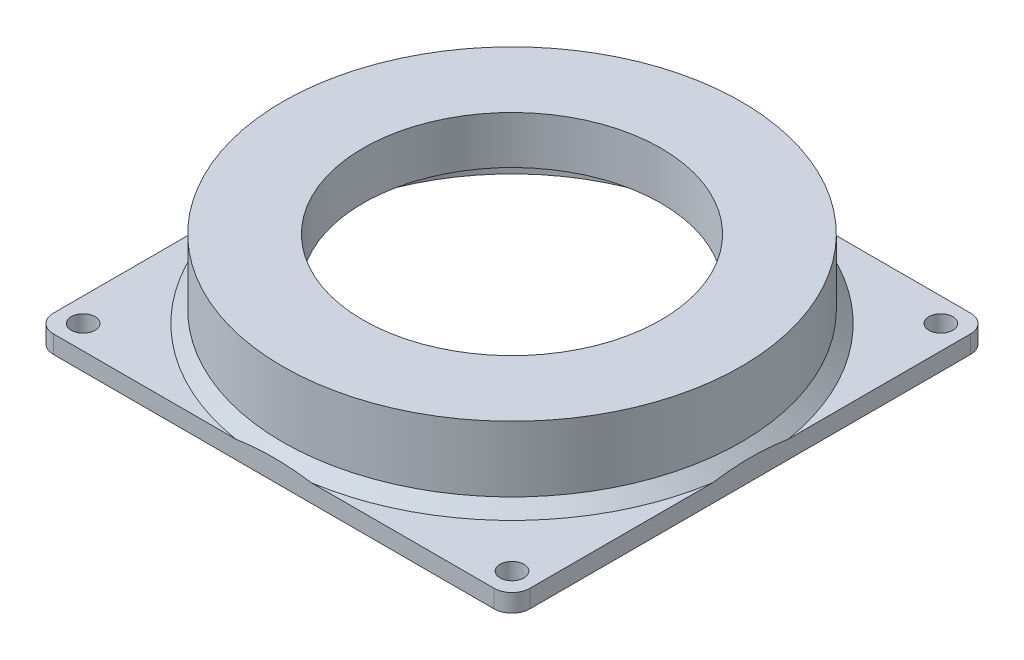
ISO-10303-21;
HEADER;
FILE_DESCRIPTION(('STEP AP214'),'2;1');
FILE_NAME('part.step','',(''),(''),'','','');
FILE_SCHEMA(('AUTOMOTIVE_DESIGN { 1 0 10303 214 1 1 1 1 }'));
ENDSEC;
DATA;
#1=APPLICATION_CONTEXT('core data for automotive mechanical design processes');
#2=APPLICATION_PROTOCOL_DEFINITION('international standard','automotive_design',2000,#1);
#3=PRODUCT_CONTEXT('',#1,'mechanical');
#4=PRODUCT('Part','Part','',(#3));
#5=PRODUCT_RELATED_PRODUCT_CATEGORY('part','',(#4));
#6=PRODUCT_DEFINITION_FORMATION('','',#4);
#7=PRODUCT_DEFINITION_CONTEXT('part definition',#1,'design');
#8=PRODUCT_DEFINITION('design','',#6,#7);
#9=PRODUCT_DEFINITION_SHAPE('','',#8);
#10=(LENGTH_UNIT() NAMED_UNIT(*) SI_UNIT(.MILLI.,.METRE.));
#11=(NAMED_UNIT(*) PLANE_ANGLE_UNIT() SI_UNIT($,.RADIAN.));
#12=(NAMED_UNIT(*) SI_UNIT($,.STERADIAN.) SOLID_ANGLE_UNIT());
#13=UNCERTAINTY_MEASURE_WITH_UNIT(LENGTH_MEASURE(1.E-05),#10,'distance_accuracy_value','');
#14=(GEOMETRIC_REPRESENTATION_CONTEXT(3) GLOBAL_UNCERTAINTY_ASSIGNED_CONTEXT((#13)) GLOBAL_UNIT_ASSIGNED_CONTEXT((#10,
#11,#12)) REPRESENTATION_CONTEXT('',''));
#15=CARTESIAN_POINT('',(0.,0.,0.));
#16=DIRECTION('',(0.,0.,1.));
#17=DIRECTION('',(1.,0.,0.));
#18=AXIS2_PLACEMENT_3D('',#15,#16,#17);
#19=CARTESIAN_POINT('',(0.,3.,0.));
#20=DIRECTION('',(0.,1.,0.));
#21=DIRECTION('',(0.,0.,1.));
#22=AXIS2_PLACEMENT_3D('',#19,#20,#21);
#23=PLANE('',#22);
#24=CARTESIAN_POINT('',(-36.,3.,-36.));
#25=DIRECTION('',(0.,1.,0.));
#26=DIRECTION('',(0.,0.,1.));
#27=AXIS2_PLACEMENT_3D('',#24,#25,#26);
#28=CIRCLE('',#27,2.);
#29=CARTESIAN_POINT('',(-36.,3.,-34.));
#30=VERTEX_POINT('',#29);
#31=EDGE_CURVE('E337',#30,#30,#28,.T.);
#32=ORIENTED_EDGE('',*,*,#31,.F.);
#33=EDGE_LOOP('',(#32));
#34=FACE_BOUND('',#33,.T.);
#35=DIRECTION('',(0.,0.,1.));
#36=VECTOR('',#35,1.);
#37=CARTESIAN_POINT('',(-40.,3.,-40.));
#38=LINE('',#37,#36);
#39=CARTESIAN_POINT('',(-40.,3.,-37.));
#40=VERTEX_POINT('',#39);
#41=CARTESIAN_POINT('',(-40.,3.,-6.34428877022489));
#42=VERTEX_POINT('',#41);
#43=EDGE_CURVE('E150',#40,#42,#38,.T.);
#44=ORIENTED_EDGE('',*,*,#43,.T.);
#45=CARTESIAN_POINT('',(0.,3.,0.));
#46=DIRECTION('',(0.,1.,0.));
#47=DIRECTION('',(0.,0.,1.));
#48=AXIS2_PLACEMENT_3D('',#45,#46,#47);
#49=CIRCLE('',#48,40.5);
#50=CARTESIAN_POINT('',(-6.34428877022494,3.,-40.));
#51=VERTEX_POINT('',#50);
#52=EDGE_CURVE('E209',#42,#51,#49,.F.);
#53=ORIENTED_EDGE('',*,*,#52,.T.);
#54=DIRECTION('',(-1.,0.,0.));
#55=VECTOR('',#54,1.);
#56=CARTESIAN_POINT('',(-40.,3.,-40.));
#57=LINE('',#56,#55);
#58=CARTESIAN_POINT('',(-37.,3.,-40.));
#59=VERTEX_POINT('',#58);
#60=EDGE_CURVE('E298',#51,#59,#57,.T.);
#61=ORIENTED_EDGE('',*,*,#60,.T.);
#62=CARTESIAN_POINT('',(-37.,3.,-37.));
#63=DIRECTION('',(0.,1.,0.));
#64=DIRECTION('',(0.,0.,1.));
#65=AXIS2_PLACEMENT_3D('',#62,#63,#64);
#66=CIRCLE('',#65,3.);
#67=EDGE_CURVE('E181',#59,#40,#66,.T.);
#68=ORIENTED_EDGE('',*,*,#67,.T.);
#69=EDGE_LOOP('',(#44,#53,#61,#68));
#70=FACE_BOUND('',#69,.T.);
#71=ADVANCED_FACE('F33',(#34,#70),#23,.T.);
#72=CARTESIAN_POINT('',(36.,3.,-36.));
#73=DIRECTION('',(0.,1.,0.));
#74=DIRECTION('',(0.,0.,1.));
#75=AXIS2_PLACEMENT_3D('',#72,#73,#74);
#76=CIRCLE('',#75,2.);
#77=CARTESIAN_POINT('',(36.,3.,-34.));
#78=VERTEX_POINT('',#77);
#79=EDGE_CURVE('E366',#78,#78,#76,.T.);
#80=ORIENTED_EDGE('',*,*,#79,.F.);
#81=EDGE_LOOP('',(#80));
#82=FACE_BOUND('',#81,.T.);
#83=CARTESIAN_POINT('',(37.,3.,-40.));
#84=VERTEX_POINT('',#83);
#85=CARTESIAN_POINT('',(6.34428877022494,3.,-40.));
#86=VERTEX_POINT('',#85);
#87=EDGE_CURVE('E345',#84,#86,#57,.T.);
#88=ORIENTED_EDGE('',*,*,#87,.T.);
#89=CARTESIAN_POINT('',(0.,3.,0.));
#90=DIRECTION('',(0.,1.,0.));
#91=DIRECTION('',(0.,0.,1.));
#92=AXIS2_PLACEMENT_3D('',#89,#90,#91);
#93=CIRCLE('',#92,40.5);
#94=CARTESIAN_POINT('',(40.,3.,-6.34428877022499));
#95=VERTEX_POINT('',#94);
#96=EDGE_CURVE('E53',#86,#95,#93,.F.);
#97=ORIENTED_EDGE('',*,*,#96,.T.);
#98=DIRECTION('',(0.,0.,-1.));
#99=VECTOR('',#98,1.);
#100=CARTESIAN_POINT('',(40.,3.,-40.));
#101=LINE('',#100,#99);
#102=CARTESIAN_POINT('',(40.,3.,-37.));
#103=VERTEX_POINT('',#102);
#104=EDGE_CURVE('E160',#95,#103,#101,.T.);
#105=ORIENTED_EDGE('',*,*,#104,.T.);
#106=CARTESIAN_POINT('',(37.,3.,-37.));
#107=DIRECTION('',(0.,1.,0.));
#108=DIRECTION('',(0.,0.,1.));
#109=AXIS2_PLACEMENT_3D('',#106,#107,#108);
#110=CIRCLE('',#109,3.);
#111=EDGE_CURVE('E179',#103,#84,#110,.T.);
#112=ORIENTED_EDGE('',*,*,#111,.T.);
#113=EDGE_LOOP('',(#88,#97,#105,#112));
#114=FACE_BOUND('',#113,.T.);
#115=ADVANCED_FACE('F263',(#82,#114),#23,.T.);
#116=CARTESIAN_POINT('',(36.,3.,36.));
#117=DIRECTION('',(0.,1.,0.));
#118=DIRECTION('',(0.,0.,1.));
#119=AXIS2_PLACEMENT_3D('',#116,#117,#118);
#120=CIRCLE('',#119,2.);
#121=CARTESIAN_POINT('',(36.,3.,38.));
#122=VERTEX_POINT('',#121);
#123=EDGE_CURVE('E292',#122,#122,#120,.T.);
#124=ORIENTED_EDGE('',*,*,#123,.F.);
#125=EDGE_LOOP('',(#124));
#126=FACE_BOUND('',#125,.T.);
#127=CARTESIAN_POINT('',(40.,3.,37.));
#128=VERTEX_POINT('',#127);
#129=CARTESIAN_POINT('',(40.,3.,6.34428877022499));
#130=VERTEX_POINT('',#129);
#131=EDGE_CURVE('E293',#128,#130,#101,.T.);
#132=ORIENTED_EDGE('',*,*,#131,.T.);
#133=CARTESIAN_POINT('',(0.,3.,0.));
#134=DIRECTION('',(0.,1.,0.));
#135=DIRECTION('',(0.,0.,1.));
#136=AXIS2_PLACEMENT_3D('',#133,#134,#135);
#137=CIRCLE('',#136,40.5);
#138=CARTESIAN_POINT('',(6.34428877022494,3.,40.));
#139=VERTEX_POINT('',#138);
#140=EDGE_CURVE('E206',#130,#139,#137,.F.);
#141=ORIENTED_EDGE('',*,*,#140,.T.);
#142=DIRECTION('',(1.,0.,0.));
#143=VECTOR('',#142,1.);
#144=CARTESIAN_POINT('',(-40.,3.,40.));
#145=LINE('',#144,#143);
#146=CARTESIAN_POINT('',(37.,3.,40.));
#147=VERTEX_POINT('',#146);
#148=EDGE_CURVE('E349',#139,#147,#145,.T.);
#149=ORIENTED_EDGE('',*,*,#148,.T.);
#150=CARTESIAN_POINT('',(37.,3.,37.));
#151=DIRECTION('',(0.,1.,0.));
#152=DIRECTION('',(0.,0.,1.));
#153=AXIS2_PLACEMENT_3D('',#150,#151,#152);
#154=CIRCLE('',#153,3.);
#155=EDGE_CURVE('E177',#147,#128,#154,.T.);
#156=ORIENTED_EDGE('',*,*,#155,.T.);
#157=EDGE_LOOP('',(#132,#141,#149,#156));
#158=FACE_BOUND('',#157,.T.);
#159=ADVANCED_FACE('F269',(#126,#158),#23,.T.);
#160=CARTESIAN_POINT('',(0.,13.,0.));
#161=DIRECTION('',(0.,1.,0.));
#162=DIRECTION('',(0.,0.,1.));
#163=AXIS2_PLACEMENT_3D('',#160,#161,#162);
#164=PLANE('',#163);
#165=CARTESIAN_POINT('',(0.,13.,0.));
#166=DIRECTION('',(0.,1.,0.));
#167=DIRECTION('',(0.,0.,1.));
#168=AXIS2_PLACEMENT_3D('',#165,#166,#167);
#169=CIRCLE('',#168,30.5);
#170=CARTESIAN_POINT('',(0.,13.,30.5));
#171=VERTEX_POINT('',#170);
#172=EDGE_CURVE('E198',#171,#171,#169,.T.);
#173=ORIENTED_EDGE('',*,*,#172,.T.);
#174=EDGE_LOOP('',(#173));
#175=FACE_BOUND('',#174,.T.);
#176=CARTESIAN_POINT('',(0.,13.,0.));
#177=DIRECTION('',(0.,1.,0.));
#178=DIRECTION('',(0.,0.,1.));
#179=AXIS2_PLACEMENT_3D('',#176,#177,#178);
#180=CIRCLE('',#179,35.);
#181=CARTESIAN_POINT('',(0.,13.,35.));
#182=VERTEX_POINT('',#181);
#183=EDGE_CURVE('E371',#182,#182,#180,.F.);
#184=ORIENTED_EDGE('',*,*,#183,.T.);
#185=EDGE_LOOP('',(#184));
#186=FACE_BOUND('',#185,.T.);
#187=ADVANCED_FACE('F276',(#175,#186),#164,.F.);
#188=CARTESIAN_POINT('',(-37.,3.,40.));
#189=VERTEX_POINT('',#188);
#190=CARTESIAN_POINT('',(-6.34428877022494,3.,40.));
#191=VERTEX_POINT('',#190);
#192=EDGE_CURVE('E166',#189,#191,#145,.T.);
#193=ORIENTED_EDGE('',*,*,#192,.T.);
#194=CARTESIAN_POINT('',(0.,3.,0.));
#195=DIRECTION('',(0.,1.,0.));
#196=DIRECTION('',(0.,0.,1.));
#197=AXIS2_PLACEMENT_3D('',#194,#195,#196);
#198=CIRCLE('',#197,40.5);
#199=CARTESIAN_POINT('',(-40.,3.,6.34428877022489));
#200=VERTEX_POINT('',#199);
#201=EDGE_CURVE('E204',#191,#200,#198,.F.);
#202=ORIENTED_EDGE('',*,*,#201,.T.);
#203=CARTESIAN_POINT('',(-40.,3.,37.));
#204=VERTEX_POINT('',#203);
#205=EDGE_CURVE('E347',#200,#204,#38,.T.);
#206=ORIENTED_EDGE('',*,*,#205,.T.);
#207=CARTESIAN_POINT('',(-37.,3.,37.));
#208=DIRECTION('',(0.,1.,0.));
#209=DIRECTION('',(0.,0.,1.));
#210=AXIS2_PLACEMENT_3D('',#207,#208,#209);
#211=CIRCLE('',#210,3.);
#212=EDGE_CURVE('E175',#204,#189,#211,.T.);
#213=ORIENTED_EDGE('',*,*,#212,.T.);
#214=EDGE_LOOP('',(#193,#202,#206,#213));
#215=FACE_BOUND('',#214,.T.);
#216=CARTESIAN_POINT('',(-36.,3.,36.));
#217=DIRECTION('',(0.,1.,0.));
#218=DIRECTION('',(0.,0.,1.));
#219=AXIS2_PLACEMENT_3D('',#216,#217,#218);
#220=CIRCLE('',#219,2.);
#221=CARTESIAN_POINT('',(-36.,3.,38.));
#222=VERTEX_POINT('',#221);
#223=EDGE_CURVE('E362',#222,#222,#220,.T.);
#224=ORIENTED_EDGE('',*,*,#223,.F.);
#225=EDGE_LOOP('',(#224));
#226=FACE_BOUND('',#225,.T.);
#227=ADVANCED_FACE('F232',(#215,#226),#23,.T.);
#228=CARTESIAN_POINT('',(40.,3.,-40.));
#229=DIRECTION('',(-1.,0.,0.));
#230=DIRECTION('',(0.,0.,1.));
#231=AXIS2_PLACEMENT_3D('',#228,#229,#230);
#232=PLANE('',#231);
#233=DIRECTION('',(0.,0.,-1.));
#234=VECTOR('',#233,1.);
#235=CARTESIAN_POINT('',(40.,0.,-40.));
#236=LINE('',#235,#234);
#237=CARTESIAN_POINT('',(40.,0.,37.));
#238=VERTEX_POINT('',#237);
#239=CARTESIAN_POINT('',(40.,0.,-37.));
#240=VERTEX_POINT('',#239);
#241=EDGE_CURVE('E162',#238,#240,#236,.T.);
#242=ORIENTED_EDGE('',*,*,#241,.T.);
#243=DIRECTION('',(0.,-1.,0.));
#244=VECTOR('',#243,1.);
#245=CARTESIAN_POINT('',(40.,3.,-37.));
#246=LINE('',#245,#244);
#247=EDGE_CURVE('E186',#240,#103,#246,.F.);
#248=ORIENTED_EDGE('',*,*,#247,.T.);
#249=ORIENTED_EDGE('',*,*,#104,.F.);
#250=CARTESIAN_POINT('',(40.,3.,-6.34428877022499));
#251=CARTESIAN_POINT('',(40.,3.0824390869814,-5.8182434566527));
#252=CARTESIAN_POINT('',(40.,3.15505779027893,-5.29063688369538));
#253=CARTESIAN_POINT('',(40.,3.28006415583981,-4.23299560232319));
#254=CARTESIAN_POINT('',(40.,3.33245030112589,-3.70296071485406));
#255=CARTESIAN_POINT('',(40.,3.41613056459918,-2.64450188107705));
#256=CARTESIAN_POINT('',(40.,3.44755244831649,-2.1160880821536));
#257=CARTESIAN_POINT('',(40.,3.48948677165724,-1.05844950125707));
#258=CARTESIAN_POINT('',(40.,3.50000000000004,-0.529224750628535));
#259=CARTESIAN_POINT('',(40.,3.50000000000004,0.529224750628534));
#260=CARTESIAN_POINT('',(40.,3.48948677165724,1.05844950125707));
#261=CARTESIAN_POINT('',(40.,3.44755244831649,2.1160880821536));
#262=CARTESIAN_POINT('',(40.,3.41613056459918,2.64450188107705));
#263=CARTESIAN_POINT('',(40.,3.33245030112589,3.70296071485406));
#264=CARTESIAN_POINT('',(40.,3.28006415583981,4.23299560232319));
#265=CARTESIAN_POINT('',(40.,3.15505779027893,5.29063688369538));
#266=CARTESIAN_POINT('',(40.,3.0824390869814,5.8182434566527));
#267=CARTESIAN_POINT('',(40.,3.,6.34428877022499));
#268=B_SPLINE_CURVE_WITH_KNOTS('',3,(#250,#251,#252,#253,#254,#255,#256,#257,#258,#259,#260,
#261,#262,#263,#264,#265,#266,#267),.UNSPECIFIED.,.F.,.F.,(4,2,2,2,2,2,2,2,4),(0.,
1.59733788783084,3.19479551608665,4.78242636288163,6.36999731969783,7.95756827651402,
9.545199123309,11.1426567515648,12.7399946393957),.UNSPECIFIED.);
#269=EDGE_CURVE('E60',#95,#130,#268,.T.);
#270=ORIENTED_EDGE('',*,*,#269,.T.);
#271=ORIENTED_EDGE('',*,*,#131,.F.);
#272=DIRECTION('',(0.,-1.,0.));
#273=VECTOR('',#272,1.);
#274=CARTESIAN_POINT('',(40.,3.,37.));
#275=LINE('',#274,#273);
#276=EDGE_CURVE('E183',#128,#238,#275,.T.);
#277=ORIENTED_EDGE('',*,*,#276,.T.);
#278=EDGE_LOOP('',(#242,#248,#249,#270,#271,#277));
#279=FACE_BOUND('',#278,.T.);
#280=ADVANCED_FACE('F225',(#279),#232,.F.);
#281=CARTESIAN_POINT('',(-40.,3.,-40.));
#282=DIRECTION('',(0.,0.,1.));
#283=DIRECTION('',(1.,0.,0.));
#284=AXIS2_PLACEMENT_3D('',#281,#282,#283);
#285=PLANE('',#284);
#286=DIRECTION('',(-1.,0.,0.));
#287=VECTOR('',#286,1.);
#288=CARTESIAN_POINT('',(-40.,0.,-40.));
#289=LINE('',#288,#287);
#290=CARTESIAN_POINT('',(37.,0.,-40.));
#291=VERTEX_POINT('',#290);
#292=CARTESIAN_POINT('',(-37.,0.,-40.));
#293=VERTEX_POINT('',#292);
#294=EDGE_CURVE('E157',#291,#293,#289,.T.);
#295=ORIENTED_EDGE('',*,*,#294,.T.);
#296=DIRECTION('',(0.,-1.,0.));
#297=VECTOR('',#296,1.);
#298=CARTESIAN_POINT('',(-37.,3.,-40.));
#299=LINE('',#298,#297);
#300=EDGE_CURVE('E134',#293,#59,#299,.F.);
#301=ORIENTED_EDGE('',*,*,#300,.T.);
#302=ORIENTED_EDGE('',*,*,#60,.F.);
#303=CARTESIAN_POINT('',(-6.34428877022494,3.,-40.));
#304=CARTESIAN_POINT('',(-5.81824345665265,3.0824390869814,-40.));
#305=CARTESIAN_POINT('',(-5.29063688369534,3.15505779027892,-40.));
#306=CARTESIAN_POINT('',(-4.23299560232316,3.2800641558398,-40.));
#307=CARTESIAN_POINT('',(-3.70296071485403,3.33245030112588,-40.));
#308=CARTESIAN_POINT('',(-2.64450188107703,3.41613056459917,-40.));
#309=CARTESIAN_POINT('',(-2.11608808215358,3.44755244831648,-40.));
#310=CARTESIAN_POINT('',(-1.05844950125706,3.48948677165723,-40.));
#311=CARTESIAN_POINT('',(-0.52922475062853,3.50000000000003,-40.));
#312=CARTESIAN_POINT('',(0.529224750628531,3.50000000000003,-40.));
#313=CARTESIAN_POINT('',(1.05844950125706,3.48948677165723,-40.));
#314=CARTESIAN_POINT('',(2.11608808215358,3.44755244831648,-40.));
#315=CARTESIAN_POINT('',(2.64450188107703,3.41613056459917,-40.));
#316=CARTESIAN_POINT('',(3.70296071485404,3.33245030112588,-40.));
#317=CARTESIAN_POINT('',(4.23299560232316,3.2800641558398,-40.));
#318=CARTESIAN_POINT('',(5.29063688369534,3.15505779027892,-40.));
#319=CARTESIAN_POINT('',(5.81824345665265,3.0824390869814,-40.));
#320=CARTESIAN_POINT('',(6.34428877022494,3.,-40.));
#321=B_SPLINE_CURVE_WITH_KNOTS('',3,(#303,#304,#305,#306,#307,#308,#309,#310,#311,#312,#313,
#314,#315,#316,#317,#318,#319,#320),.UNSPECIFIED.,.F.,.F.,(4,2,2,2,2,2,2,2,4),(0.,
1.59733788783082,3.19479551608663,4.78242636288159,6.36999731969778,7.95756827651396,
9.54519912330892,11.1426567515647,12.7399946393956),.UNSPECIFIED.);
#322=EDGE_CURVE('E212',#51,#86,#321,.T.);
#323=ORIENTED_EDGE('',*,*,#322,.T.);
#324=ORIENTED_EDGE('',*,*,#87,.F.);
#325=DIRECTION('',(0.,-1.,0.));
#326=VECTOR('',#325,1.);
#327=CARTESIAN_POINT('',(37.,3.,-40.));
#328=LINE('',#327,#326);
#329=EDGE_CURVE('E139',#84,#291,#328,.T.);
#330=ORIENTED_EDGE('',*,*,#329,.T.);
#331=EDGE_LOOP('',(#295,#301,#302,#323,#324,#330));
#332=FACE_BOUND('',#331,.T.);
#333=ADVANCED_FACE('F222',(#332),#285,.F.);
#334=CARTESIAN_POINT('',(-40.,3.,-40.));
#335=DIRECTION('',(1.,0.,0.));
#336=DIRECTION('',(0.,0.,-1.));
#337=AXIS2_PLACEMENT_3D('',#334,#335,#336);
#338=PLANE('',#337);
#339=ORIENTED_EDGE('',*,*,#43,.F.);
#340=DIRECTION('',(0.,-1.,0.));
#341=VECTOR('',#340,1.);
#342=CARTESIAN_POINT('',(-40.,3.,-37.));
#343=LINE('',#342,#341);
#344=CARTESIAN_POINT('',(-40.,0.,-37.));
#345=VERTEX_POINT('',#344);
#346=EDGE_CURVE('E132',#40,#345,#343,.T.);
#347=ORIENTED_EDGE('',*,*,#346,.T.);
#348=DIRECTION('',(0.,0.,1.));
#349=VECTOR('',#348,1.);
#350=CARTESIAN_POINT('',(-40.,0.,-40.));
#351=LINE('',#350,#349);
#352=CARTESIAN_POINT('',(-40.,0.,37.));
#353=VERTEX_POINT('',#352);
#354=EDGE_CURVE('E147',#345,#353,#351,.T.);
#355=ORIENTED_EDGE('',*,*,#354,.T.);
#356=DIRECTION('',(0.,-1.,0.));
#357=VECTOR('',#356,1.);
#358=CARTESIAN_POINT('',(-40.,3.,37.));
#359=LINE('',#358,#357);
#360=EDGE_CURVE('E152',#353,#204,#359,.F.);
#361=ORIENTED_EDGE('',*,*,#360,.T.);
#362=ORIENTED_EDGE('',*,*,#205,.F.);
#363=CARTESIAN_POINT('',(-40.,3.,6.34428877022489));
#364=CARTESIAN_POINT('',(-40.,3.0824390869814,5.81824345665261));
#365=CARTESIAN_POINT('',(-40.,3.15505779027892,5.2906368836953));
#366=CARTESIAN_POINT('',(-40.,3.2800641558398,4.23299560232313));
#367=CARTESIAN_POINT('',(-40.,3.33245030112588,3.70296071485401));
#368=CARTESIAN_POINT('',(-40.,3.41613056459917,2.64450188107701));
#369=CARTESIAN_POINT('',(-40.,3.44755244831647,2.11608808215357));
#370=CARTESIAN_POINT('',(-40.,3.48948677165723,1.05844950125706));
#371=CARTESIAN_POINT('',(-40.,3.50000000000003,0.52922475062853));
#372=CARTESIAN_POINT('',(-40.,3.50000000000003,-0.529224750628522));
#373=CARTESIAN_POINT('',(-40.,3.48948677165723,-1.05844950125705));
#374=CARTESIAN_POINT('',(-40.,3.44755244831648,-2.11608808215356));
#375=CARTESIAN_POINT('',(-40.,3.41613056459917,-2.644501881077));
#376=CARTESIAN_POINT('',(-40.,3.33245030112588,-3.702960714854));
#377=CARTESIAN_POINT('',(-40.,3.2800641558398,-4.23299560232312));
#378=CARTESIAN_POINT('',(-40.,3.15505779027892,-5.29063688369529));
#379=CARTESIAN_POINT('',(-40.,3.0824390869814,-5.8182434566526));
#380=CARTESIAN_POINT('',(-40.,3.,-6.34428877022489));
#381=B_SPLINE_CURVE_WITH_KNOTS('',3,(#363,#364,#365,#366,#367,#368,#369,#370,#371,#372,#373,
#374,#375,#376,#377,#378,#379,#380),.UNSPECIFIED.,.F.,.F.,(4,2,2,2,2,2,2,2,4),(0.,
1.59733788783081,3.1947955160866,4.78242636288156,6.36999731969772,7.95756827651389,
9.54519912330885,11.1426567515646,12.7399946393954),.UNSPECIFIED.);
#382=EDGE_CURVE('E11',#200,#42,#381,.T.);
#383=ORIENTED_EDGE('',*,*,#382,.T.);
#384=EDGE_LOOP('',(#339,#347,#355,#361,#362,#383));
#385=FACE_BOUND('',#384,.T.);
#386=ADVANCED_FACE('F145',(#385),#338,.F.);
#387=CARTESIAN_POINT('',(-40.,3.,40.));
#388=DIRECTION('',(0.,0.,-1.));
#389=DIRECTION('',(-1.,0.,0.));
#390=AXIS2_PLACEMENT_3D('',#387,#388,#389);
#391=PLANE('',#390);
#392=DIRECTION('',(1.,0.,0.));
#393=VECTOR('',#392,1.);
#394=CARTESIAN_POINT('',(-40.,0.,40.));
#395=LINE('',#394,#393);
#396=CARTESIAN_POINT('',(-37.,0.,40.));
#397=VERTEX_POINT('',#396);
#398=CARTESIAN_POINT('',(37.,0.,40.));
#399=VERTEX_POINT('',#398);
#400=EDGE_CURVE('E156',#397,#399,#395,.T.);
#401=ORIENTED_EDGE('',*,*,#400,.T.);
#402=DIRECTION('',(0.,-1.,0.));
#403=VECTOR('',#402,1.);
#404=CARTESIAN_POINT('',(37.,3.,40.));
#405=LINE('',#404,#403);
#406=EDGE_CURVE('E192',#399,#147,#405,.F.);
#407=ORIENTED_EDGE('',*,*,#406,.T.);
#408=ORIENTED_EDGE('',*,*,#148,.F.);
#409=CARTESIAN_POINT('',(6.34428877022494,3.,40.));
#410=CARTESIAN_POINT('',(5.81824345665265,3.0824390869814,40.));
#411=CARTESIAN_POINT('',(5.29063688369534,3.15505779027892,40.));
#412=CARTESIAN_POINT('',(4.23299560232316,3.2800641558398,40.));
#413=CARTESIAN_POINT('',(3.70296071485403,3.33245030112588,40.));
#414=CARTESIAN_POINT('',(2.64450188107703,3.41613056459917,40.));
#415=CARTESIAN_POINT('',(2.11608808215358,3.44755244831648,40.));
#416=CARTESIAN_POINT('',(1.05844950125706,3.48948677165723,40.));
#417=CARTESIAN_POINT('',(0.52922475062853,3.50000000000003,40.));
#418=CARTESIAN_POINT('',(-0.529224750628531,3.50000000000003,40.));
#419=CARTESIAN_POINT('',(-1.05844950125706,3.48948677165723,40.));
#420=CARTESIAN_POINT('',(-2.11608808215358,3.44755244831648,40.));
#421=CARTESIAN_POINT('',(-2.64450188107703,3.41613056459917,40.));
#422=CARTESIAN_POINT('',(-3.70296071485404,3.33245030112588,40.));
#423=CARTESIAN_POINT('',(-4.23299560232316,3.2800641558398,40.));
#424=CARTESIAN_POINT('',(-5.29063688369534,3.15505779027892,40.));
#425=CARTESIAN_POINT('',(-5.81824345665265,3.0824390869814,40.));
#426=CARTESIAN_POINT('',(-6.34428877022494,3.,40.));
#427=B_SPLINE_CURVE_WITH_KNOTS('',3,(#409,#410,#411,#412,#413,#414,#415,#416,#417,#418,#419,
#420,#421,#422,#423,#424,#425,#426),.UNSPECIFIED.,.F.,.F.,(4,2,2,2,2,2,2,2,4),(0.,
1.59733788783082,3.19479551608663,4.78242636288159,6.36999731969778,7.95756827651396,
9.54519912330892,11.1426567515647,12.7399946393956),.UNSPECIFIED.);
#428=EDGE_CURVE('E46',#139,#191,#427,.T.);
#429=ORIENTED_EDGE('',*,*,#428,.T.);
#430=ORIENTED_EDGE('',*,*,#192,.F.);
#431=DIRECTION('',(0.,-1.,0.));
#432=VECTOR('',#431,1.);
#433=CARTESIAN_POINT('',(-37.,3.,40.));
#434=LINE('',#433,#432);
#435=EDGE_CURVE('E189',#189,#397,#434,.T.);
#436=ORIENTED_EDGE('',*,*,#435,.T.);
#437=EDGE_LOOP('',(#401,#407,#408,#429,#430,#436));
#438=FACE_BOUND('',#437,.T.);
#439=ADVANCED_FACE('F309',(#438),#391,.F.);
#440=CARTESIAN_POINT('',(0.,0.,0.));
#441=DIRECTION('',(0.,1.,0.));
#442=DIRECTION('',(0.,0.,1.));
#443=AXIS2_PLACEMENT_3D('',#440,#441,#442);
#444=PLANE('',#443);
#445=CARTESIAN_POINT('',(0.,0.,0.));
#446=DIRECTION('',(0.,1.,0.));
#447=DIRECTION('',(0.,0.,1.));
#448=AXIS2_PLACEMENT_3D('',#445,#446,#447);
#449=CIRCLE('',#448,35.);
#450=CARTESIAN_POINT('',(0.,0.,35.));
#451=VERTEX_POINT('',#450);
#452=EDGE_CURVE('E320',#451,#451,#449,.T.);
#453=ORIENTED_EDGE('',*,*,#452,.T.);
#454=EDGE_LOOP('',(#453));
#455=FACE_BOUND('',#454,.T.);
#456=CARTESIAN_POINT('',(36.,0.,-36.));
#457=DIRECTION('',(0.,1.,0.));
#458=DIRECTION('',(0.,0.,1.));
#459=AXIS2_PLACEMENT_3D('',#456,#457,#458);
#460=CIRCLE('',#459,2.);
#461=CARTESIAN_POINT('',(36.,0.,-34.));
#462=VERTEX_POINT('',#461);
#463=EDGE_CURVE('E324',#462,#462,#460,.T.);
#464=ORIENTED_EDGE('',*,*,#463,.T.);
#465=EDGE_LOOP('',(#464));
#466=FACE_BOUND('',#465,.T.);
#467=CARTESIAN_POINT('',(-36.,0.,36.));
#468=DIRECTION('',(0.,1.,0.));
#469=DIRECTION('',(0.,0.,1.));
#470=AXIS2_PLACEMENT_3D('',#467,#468,#469);
#471=CIRCLE('',#470,2.);
#472=CARTESIAN_POINT('',(-36.,0.,38.));
#473=VERTEX_POINT('',#472);
#474=EDGE_CURVE('E328',#473,#473,#471,.T.);
#475=ORIENTED_EDGE('',*,*,#474,.T.);
#476=EDGE_LOOP('',(#475));
#477=FACE_BOUND('',#476,.T.);
#478=CARTESIAN_POINT('',(36.,0.,36.));
#479=DIRECTION('',(0.,1.,0.));
#480=DIRECTION('',(0.,0.,1.));
#481=AXIS2_PLACEMENT_3D('',#478,#479,#480);
#482=CIRCLE('',#481,2.);
#483=CARTESIAN_POINT('',(36.,0.,38.));
#484=VERTEX_POINT('',#483);
#485=EDGE_CURVE('E332',#484,#484,#482,.T.);
#486=ORIENTED_EDGE('',*,*,#485,.T.);
#487=EDGE_LOOP('',(#486));
#488=FACE_BOUND('',#487,.T.);
#489=CARTESIAN_POINT('',(-36.,0.,-36.));
#490=DIRECTION('',(0.,1.,0.));
#491=DIRECTION('',(0.,0.,1.));
#492=AXIS2_PLACEMENT_3D('',#489,#490,#491);
#493=CIRCLE('',#492,2.);
#494=CARTESIAN_POINT('',(-36.,0.,-34.));
#495=VERTEX_POINT('',#494);
#496=EDGE_CURVE('E335',#495,#495,#493,.T.);
#497=ORIENTED_EDGE('',*,*,#496,.T.);
#498=EDGE_LOOP('',(#497));
#499=FACE_BOUND('',#498,.T.);
#500=ORIENTED_EDGE('',*,*,#354,.F.);
#501=CARTESIAN_POINT('',(-37.,0.,-37.));
#502=DIRECTION('',(0.,1.,0.));
#503=DIRECTION('',(0.,0.,1.));
#504=AXIS2_PLACEMENT_3D('',#501,#502,#503);
#505=CIRCLE('',#504,3.);
#506=EDGE_CURVE('E128',#345,#293,#505,.F.);
#507=ORIENTED_EDGE('',*,*,#506,.T.);
#508=ORIENTED_EDGE('',*,*,#294,.F.);
#509=CARTESIAN_POINT('',(37.,0.,-37.));
#510=DIRECTION('',(0.,1.,0.));
#511=DIRECTION('',(0.,0.,1.));
#512=AXIS2_PLACEMENT_3D('',#509,#510,#511);
#513=CIRCLE('',#512,3.);
#514=EDGE_CURVE('E140',#291,#240,#513,.F.);
#515=ORIENTED_EDGE('',*,*,#514,.T.);
#516=ORIENTED_EDGE('',*,*,#241,.F.);
#517=CARTESIAN_POINT('',(37.,0.,37.));
#518=DIRECTION('',(0.,1.,0.));
#519=DIRECTION('',(0.,0.,1.));
#520=AXIS2_PLACEMENT_3D('',#517,#518,#519);
#521=CIRCLE('',#520,3.);
#522=EDGE_CURVE('E169',#238,#399,#521,.F.);
#523=ORIENTED_EDGE('',*,*,#522,.T.);
#524=ORIENTED_EDGE('',*,*,#400,.F.);
#525=CARTESIAN_POINT('',(-37.,0.,37.));
#526=DIRECTION('',(0.,1.,0.));
#527=DIRECTION('',(0.,0.,1.));
#528=AXIS2_PLACEMENT_3D('',#525,#526,#527);
#529=CIRCLE('',#528,3.);
#530=EDGE_CURVE('E151',#397,#353,#529,.F.);
#531=ORIENTED_EDGE('',*,*,#530,.T.);
#532=EDGE_LOOP('',(#500,#507,#508,#515,#516,#523,#524,#531));
#533=FACE_BOUND('',#532,.T.);
#534=ADVANCED_FACE('F154',(#455,#466,#477,#488,#499,#533),#444,.F.);
#535=CARTESIAN_POINT('',(-37.,3.,-37.));
#536=DIRECTION('',(0.,-1.,0.));
#537=DIRECTION('',(0.,0.,-1.));
#538=AXIS2_PLACEMENT_3D('',#535,#536,#537);
#539=CYLINDRICAL_SURFACE('',#538,3.);
#540=ORIENTED_EDGE('',*,*,#67,.F.);
#541=ORIENTED_EDGE('',*,*,#300,.F.);
#542=ORIENTED_EDGE('',*,*,#506,.F.);
#543=ORIENTED_EDGE('',*,*,#346,.F.);
#544=EDGE_LOOP('',(#540,#541,#542,#543));
#545=FACE_BOUND('',#544,.T.);
#546=ADVANCED_FACE('F131',(#545),#539,.T.);
#547=CARTESIAN_POINT('',(37.,3.,-37.));
#548=DIRECTION('',(0.,-1.,0.));
#549=DIRECTION('',(0.,0.,-1.));
#550=AXIS2_PLACEMENT_3D('',#547,#548,#549);
#551=CYLINDRICAL_SURFACE('',#550,3.);
#552=ORIENTED_EDGE('',*,*,#111,.F.);
#553=ORIENTED_EDGE('',*,*,#247,.F.);
#554=ORIENTED_EDGE('',*,*,#514,.F.);
#555=ORIENTED_EDGE('',*,*,#329,.F.);
#556=EDGE_LOOP('',(#552,#553,#554,#555));
#557=FACE_BOUND('',#556,.T.);
#558=ADVANCED_FACE('F235',(#557),#551,.T.);
#559=CARTESIAN_POINT('',(37.,3.,37.));
#560=DIRECTION('',(0.,-1.,0.));
#561=DIRECTION('',(0.,0.,-1.));
#562=AXIS2_PLACEMENT_3D('',#559,#560,#561);
#563=CYLINDRICAL_SURFACE('',#562,3.);
#564=ORIENTED_EDGE('',*,*,#155,.F.);
#565=ORIENTED_EDGE('',*,*,#406,.F.);
#566=ORIENTED_EDGE('',*,*,#522,.F.);
#567=ORIENTED_EDGE('',*,*,#276,.F.);
#568=EDGE_LOOP('',(#564,#565,#566,#567));
#569=FACE_BOUND('',#568,.T.);
#570=ADVANCED_FACE('F238',(#569),#563,.T.);
#571=CARTESIAN_POINT('',(-37.,3.,37.));
#572=DIRECTION('',(0.,-1.,0.));
#573=DIRECTION('',(0.,0.,-1.));
#574=AXIS2_PLACEMENT_3D('',#571,#572,#573);
#575=CYLINDRICAL_SURFACE('',#574,3.);
#576=ORIENTED_EDGE('',*,*,#212,.F.);
#577=ORIENTED_EDGE('',*,*,#360,.F.);
#578=ORIENTED_EDGE('',*,*,#530,.F.);
#579=ORIENTED_EDGE('',*,*,#435,.F.);
#580=EDGE_LOOP('',(#576,#577,#578,#579));
#581=FACE_BOUND('',#580,.T.);
#582=ADVANCED_FACE('F242',(#581),#575,.T.);
#583=CARTESIAN_POINT('',(-36.,0.,-36.));
#584=DIRECTION('',(0.,1.,0.));
#585=DIRECTION('',(0.,0.,1.));
#586=AXIS2_PLACEMENT_3D('',#583,#584,#585);
#587=CYLINDRICAL_SURFACE('',#586,2.);
#588=ORIENTED_EDGE('',*,*,#496,.F.);
#589=EDGE_LOOP('',(#588));
#590=FACE_BOUND('',#589,.T.);
#591=ORIENTED_EDGE('',*,*,#31,.T.);
#592=EDGE_LOOP('',(#591));
#593=FACE_BOUND('',#592,.T.);
#594=ADVANCED_FACE('F245',(#590,#593),#587,.F.);
#595=CARTESIAN_POINT('',(36.,0.,36.));
#596=DIRECTION('',(0.,1.,0.));
#597=DIRECTION('',(0.,0.,1.));
#598=AXIS2_PLACEMENT_3D('',#595,#596,#597);
#599=CYLINDRICAL_SURFACE('',#598,2.);
#600=ORIENTED_EDGE('',*,*,#485,.F.);
#601=EDGE_LOOP('',(#600));
#602=FACE_BOUND('',#601,.T.);
#603=ORIENTED_EDGE('',*,*,#123,.T.);
#604=EDGE_LOOP('',(#603));
#605=FACE_BOUND('',#604,.T.);
#606=ADVANCED_FACE('F417',(#602,#605),#599,.F.);
#607=CARTESIAN_POINT('',(-36.,0.,36.));
#608=DIRECTION('',(0.,1.,0.));
#609=DIRECTION('',(0.,0.,1.));
#610=AXIS2_PLACEMENT_3D('',#607,#608,#609);
#611=CYLINDRICAL_SURFACE('',#610,2.);
#612=ORIENTED_EDGE('',*,*,#474,.F.);
#613=EDGE_LOOP('',(#612));
#614=FACE_BOUND('',#613,.T.);
#615=ORIENTED_EDGE('',*,*,#223,.T.);
#616=EDGE_LOOP('',(#615));
#617=FACE_BOUND('',#616,.T.);
#618=ADVANCED_FACE('F413',(#614,#617),#611,.F.);
#619=CARTESIAN_POINT('',(36.,0.,-36.));
#620=DIRECTION('',(0.,1.,0.));
#621=DIRECTION('',(0.,0.,1.));
#622=AXIS2_PLACEMENT_3D('',#619,#620,#621);
#623=CYLINDRICAL_SURFACE('',#622,2.);
#624=ORIENTED_EDGE('',*,*,#463,.F.);
#625=EDGE_LOOP('',(#624));
#626=FACE_BOUND('',#625,.T.);
#627=ORIENTED_EDGE('',*,*,#79,.T.);
#628=EDGE_LOOP('',(#627));
#629=FACE_BOUND('',#628,.T.);
#630=ADVANCED_FACE('F409',(#626,#629),#623,.F.);
#631=CARTESIAN_POINT('',(0.,0.,0.));
#632=DIRECTION('',(0.,1.,0.));
#633=DIRECTION('',(0.,0.,1.));
#634=AXIS2_PLACEMENT_3D('',#631,#632,#633);
#635=CYLINDRICAL_SURFACE('',#634,35.);
#636=ORIENTED_EDGE('',*,*,#452,.F.);
#637=EDGE_LOOP('',(#636));
#638=FACE_BOUND('',#637,.T.);
#639=ORIENTED_EDGE('',*,*,#183,.F.);
#640=EDGE_LOOP('',(#639));
#641=FACE_BOUND('',#640,.T.);
#642=ADVANCED_FACE('F405',(#638,#641),#635,.F.);
#643=CARTESIAN_POINT('',(0.,13.,0.));
#644=DIRECTION('',(0.,-1.,0.));
#645=DIRECTION('',(0.,0.,-1.));
#646=AXIS2_PLACEMENT_3D('',#643,#644,#645);
#647=CYLINDRICAL_SURFACE('',#646,38.5);
#648=CARTESIAN_POINT('',(0.,5.00000000000004,0.));
#649=DIRECTION('',(0.,1.,0.));
#650=DIRECTION('',(0.,0.,1.));
#651=AXIS2_PLACEMENT_3D('',#648,#649,#650);
#652=CIRCLE('',#651,38.5);
#653=CARTESIAN_POINT('',(0.,5.00000000000004,38.5));
#654=VERTEX_POINT('',#653);
#655=EDGE_CURVE('E201',#654,#654,#652,.T.);
#656=ORIENTED_EDGE('',*,*,#655,.T.);
#657=EDGE_LOOP('',(#656));
#658=FACE_BOUND('',#657,.T.);
#659=CARTESIAN_POINT('',(0.,16.,0.));
#660=DIRECTION('',(0.,1.,0.));
#661=DIRECTION('',(0.,0.,1.));
#662=AXIS2_PLACEMENT_3D('',#659,#660,#661);
#663=CIRCLE('',#662,38.5);
#664=CARTESIAN_POINT('',(0.,16.,38.5));
#665=VERTEX_POINT('',#664);
#666=EDGE_CURVE('E374',#665,#665,#663,.T.);
#667=ORIENTED_EDGE('',*,*,#666,.F.);
#668=EDGE_LOOP('',(#667));
#669=FACE_BOUND('',#668,.T.);
#670=ADVANCED_FACE('F400',(#658,#669),#647,.T.);
#671=CARTESIAN_POINT('',(0.,16.,0.));
#672=DIRECTION('',(0.,1.,0.));
#673=DIRECTION('',(0.,0.,1.));
#674=AXIS2_PLACEMENT_3D('',#671,#672,#673);
#675=PLANE('',#674);
#676=CARTESIAN_POINT('',(0.,16.,0.));
#677=DIRECTION('',(0.,1.,0.));
#678=DIRECTION('',(0.,0.,1.));
#679=AXIS2_PLACEMENT_3D('',#676,#677,#678);
#680=CIRCLE('',#679,25.);
#681=CARTESIAN_POINT('',(0.,16.,25.));
#682=VERTEX_POINT('',#681);
#683=EDGE_CURVE('E377',#682,#682,#680,.T.);
#684=ORIENTED_EDGE('',*,*,#683,.F.);
#685=EDGE_LOOP('',(#684));
#686=FACE_BOUND('',#685,.T.);
#687=ORIENTED_EDGE('',*,*,#666,.T.);
#688=EDGE_LOOP('',(#687));
#689=FACE_BOUND('',#688,.T.);
#690=ADVANCED_FACE('F395',(#686,#689),#675,.T.);
#691=CARTESIAN_POINT('',(0.,13.,0.));
#692=DIRECTION('',(0.,1.,0.));
#693=DIRECTION('',(0.,0.,1.));
#694=AXIS2_PLACEMENT_3D('',#691,#692,#693);
#695=CYLINDRICAL_SURFACE('',#694,25.);
#696=ORIENTED_EDGE('',*,*,#683,.T.);
#697=EDGE_LOOP('',(#696));
#698=FACE_BOUND('',#697,.T.);
#699=CARTESIAN_POINT('',(0.,8.,0.));
#700=DIRECTION('',(0.,-1.,0.));
#701=DIRECTION('',(0.,0.,-1.));
#702=AXIS2_PLACEMENT_3D('',#699,#700,#701);
#703=CIRCLE('',#702,25.);
#704=CARTESIAN_POINT('',(0.,8.,-25.));
#705=VERTEX_POINT('',#704);
#706=EDGE_CURVE('E383',#705,#705,#703,.T.);
#707=ORIENTED_EDGE('',*,*,#706,.T.);
#708=EDGE_LOOP('',(#707));
#709=FACE_BOUND('',#708,.T.);
#710=ADVANCED_FACE('F387',(#698,#709),#695,.F.);
#711=CARTESIAN_POINT('',(0.,8.,0.));
#712=DIRECTION('',(0.,-1.,0.));
#713=DIRECTION('',(0.,0.,-1.));
#714=AXIS2_PLACEMENT_3D('',#711,#712,#713);
#715=PLANE('',#714);
#716=CARTESIAN_POINT('',(0.,8.,0.));
#717=DIRECTION('',(0.,-1.,0.));
#718=DIRECTION('',(0.,0.,-1.));
#719=AXIS2_PLACEMENT_3D('',#716,#717,#718);
#720=CIRCLE('',#719,28.5);
#721=CARTESIAN_POINT('',(0.,8.,-28.5));
#722=VERTEX_POINT('',#721);
#723=EDGE_CURVE('E380',#722,#722,#720,.T.);
#724=ORIENTED_EDGE('',*,*,#723,.T.);
#725=EDGE_LOOP('',(#724));
#726=FACE_BOUND('',#725,.T.);
#727=ORIENTED_EDGE('',*,*,#706,.F.);
#728=EDGE_LOOP('',(#727));
#729=FACE_BOUND('',#728,.T.);
#730=ADVANCED_FACE('F257',(#726,#729),#715,.T.);
#731=CARTESIAN_POINT('',(0.,8.,0.));
#732=DIRECTION('',(0.,1.,0.));
#733=DIRECTION('',(0.,0.,1.));
#734=AXIS2_PLACEMENT_3D('',#731,#732,#733);
#735=CYLINDRICAL_SURFACE('',#734,28.5);
#736=CARTESIAN_POINT('',(0.,11.,0.));
#737=DIRECTION('',(0.,1.,0.));
#738=DIRECTION('',(0.,0.,1.));
#739=AXIS2_PLACEMENT_3D('',#736,#737,#738);
#740=CIRCLE('',#739,28.5);
#741=CARTESIAN_POINT('',(0.,11.,28.5));
#742=VERTEX_POINT('',#741);
#743=EDGE_CURVE('E195',#742,#742,#740,.F.);
#744=ORIENTED_EDGE('',*,*,#743,.T.);
#745=EDGE_LOOP('',(#744));
#746=FACE_BOUND('',#745,.T.);
#747=ORIENTED_EDGE('',*,*,#723,.F.);
#748=EDGE_LOOP('',(#747));
#749=FACE_BOUND('',#748,.T.);
#750=ADVANCED_FACE('F249',(#746,#749),#735,.T.);
#751=CARTESIAN_POINT('',(0.,11.,0.));
#752=DIRECTION('',(0.,1.,0.));
#753=DIRECTION('',(0.,0.,1.));
#754=AXIS2_PLACEMENT_3D('',#751,#752,#753);
#755=CONICAL_SURFACE('',#754,28.5,0.785398163397445);
#756=ORIENTED_EDGE('',*,*,#172,.F.);
#757=EDGE_LOOP('',(#756));
#758=FACE_BOUND('',#757,.T.);
#759=ORIENTED_EDGE('',*,*,#743,.F.);
#760=EDGE_LOOP('',(#759));
#761=FACE_BOUND('',#760,.T.);
#762=ADVANCED_FACE('F247',(#758,#761),#755,.T.);
#763=CARTESIAN_POINT('',(0.,5.00000000000004,0.));
#764=DIRECTION('',(0.,-1.,0.));
#765=DIRECTION('',(0.,0.,-1.));
#766=AXIS2_PLACEMENT_3D('',#763,#764,#765);
#767=CONICAL_SURFACE('',#766,38.5,0.785398163397443);
#768=ORIENTED_EDGE('',*,*,#322,.F.);
#769=ORIENTED_EDGE('',*,*,#52,.F.);
#770=ORIENTED_EDGE('',*,*,#382,.F.);
#771=ORIENTED_EDGE('',*,*,#201,.F.);
#772=ORIENTED_EDGE('',*,*,#428,.F.);
#773=ORIENTED_EDGE('',*,*,#140,.F.);
#774=ORIENTED_EDGE('',*,*,#269,.F.);
#775=ORIENTED_EDGE('',*,*,#96,.F.);
#776=EDGE_LOOP('',(#768,#769,#770,#771,#772,#773,#774,#775));
#777=FACE_BOUND('',#776,.T.);
#778=ORIENTED_EDGE('',*,*,#655,.F.);
#779=EDGE_LOOP('',(#778));
#780=FACE_BOUND('',#779,.T.);
#781=ADVANCED_FACE('F35',(#777,#780),#767,.T.);
#782=CLOSED_SHELL('',(#71,#115,#159,#187,#227,#280,#333,#386,#439,#534,#546,#558,#570,#582,#594,
#606,#618,#630,#642,#670,#690,#710,#730,#750,#762,#781));
#783=MANIFOLD_SOLID_BREP('B2',#782);
#784=ADVANCED_BREP_SHAPE_REPRESENTATION('',(#18,#783),#14);
#785=SHAPE_DEFINITION_REPRESENTATION(#9,#784);
ENDSEC;
END-ISO-10303-21;
